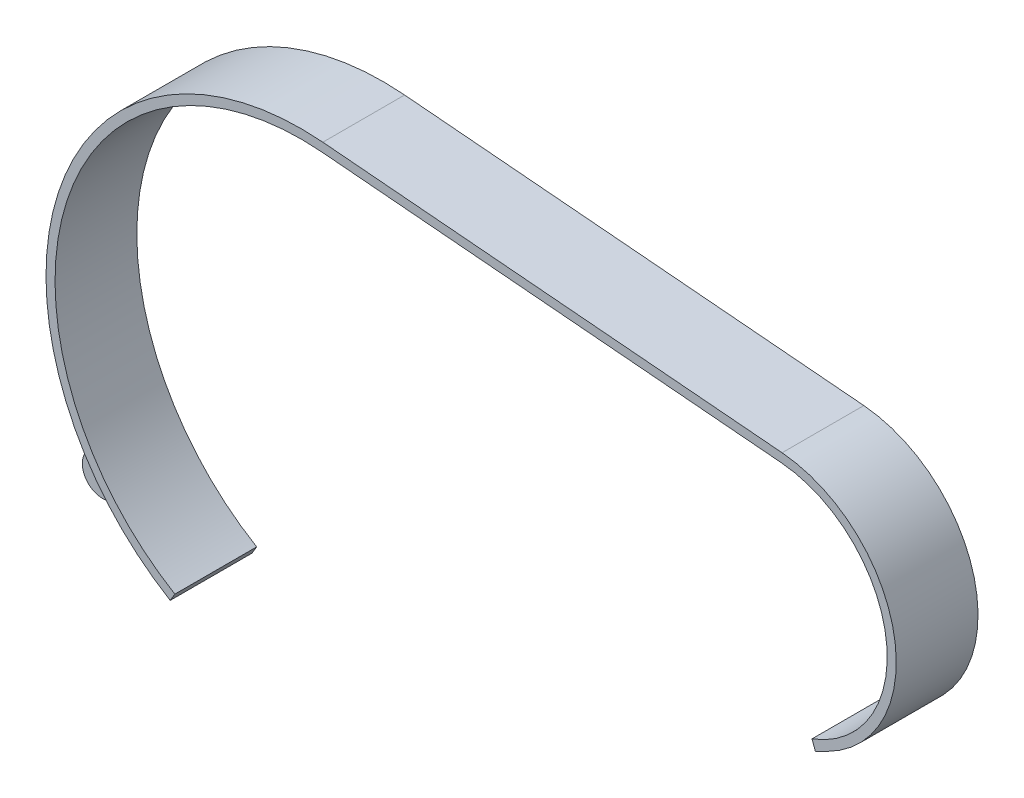
ISO-10303-21;
HEADER;
FILE_DESCRIPTION(('STEP AP214'),'2;1');
FILE_NAME('part.step','',(''),(''),'','','');
FILE_SCHEMA(('AUTOMOTIVE_DESIGN { 1 0 10303 214 1 1 1 1 }'));
ENDSEC;
DATA;
#1=APPLICATION_CONTEXT('core data for automotive mechanical design processes');
#2=APPLICATION_PROTOCOL_DEFINITION('international standard','automotive_design',2000,#1);
#3=PRODUCT_CONTEXT('',#1,'mechanical');
#4=PRODUCT('Part','Part','',(#3));
#5=PRODUCT_RELATED_PRODUCT_CATEGORY('part','',(#4));
#6=PRODUCT_DEFINITION_FORMATION('','',#4);
#7=PRODUCT_DEFINITION_CONTEXT('part definition',#1,'design');
#8=PRODUCT_DEFINITION('design','',#6,#7);
#9=PRODUCT_DEFINITION_SHAPE('','',#8);
#10=(LENGTH_UNIT() NAMED_UNIT(*) SI_UNIT(.MILLI.,.METRE.));
#11=(NAMED_UNIT(*) PLANE_ANGLE_UNIT() SI_UNIT($,.RADIAN.));
#12=(NAMED_UNIT(*) SI_UNIT($,.STERADIAN.) SOLID_ANGLE_UNIT());
#13=UNCERTAINTY_MEASURE_WITH_UNIT(LENGTH_MEASURE(1.E-05),#10,'distance_accuracy_value','');
#14=(GEOMETRIC_REPRESENTATION_CONTEXT(3) GLOBAL_UNCERTAINTY_ASSIGNED_CONTEXT((#13)) GLOBAL_UNIT_ASSIGNED_CONTEXT((#10,
#11,#12)) REPRESENTATION_CONTEXT('',''));
#15=CARTESIAN_POINT('',(0.,0.,0.));
#16=DIRECTION('',(0.,0.,1.));
#17=DIRECTION('',(1.,0.,0.));
#18=AXIS2_PLACEMENT_3D('',#15,#16,#17);
#19=CARTESIAN_POINT('',(279.400000000399,127.000000000261,25.4));
#20=DIRECTION('',(0.,0.,-1.));
#21=DIRECTION('',(-1.,0.,0.));
#22=AXIS2_PLACEMENT_3D('',#19,#20,#21);
#23=CYLINDRICAL_SURFACE('',#22,43.815);
#24=CARTESIAN_POINT('',(279.400000000399,127.000000000261,0.));
#25=DIRECTION('',(0.,0.,1.));
#26=DIRECTION('',(1.,0.,0.));
#27=AXIS2_PLACEMENT_3D('',#24,#25,#26);
#28=CIRCLE('',#27,43.815);
#29=CARTESIAN_POINT('',(299.063190221531,87.8450108503763,0.));
#30=VERTEX_POINT('',#29);
#31=CARTESIAN_POINT('',(283.138145014646,170.65524592618,0.));
#32=VERTEX_POINT('',#31);
#33=EDGE_CURVE('E232',#30,#32,#28,.T.);
#34=ORIENTED_EDGE('',*,*,#33,.T.);
#35=DIRECTION('',(0.,0.,-1.));
#36=VECTOR('',#35,1.);
#37=CARTESIAN_POINT('',(283.138145014646,170.65524592618,25.4));
#38=LINE('',#37,#36);
#39=CARTESIAN_POINT('',(283.138145014646,170.65524592618,28.702));
#40=VERTEX_POINT('',#39);
#41=EDGE_CURVE('E11',#40,#32,#38,.T.);
#42=ORIENTED_EDGE('',*,*,#41,.F.);
#43=CARTESIAN_POINT('',(279.400000000399,127.000000000261,28.702));
#44=DIRECTION('',(0.,0.,1.));
#45=DIRECTION('',(1.,0.,0.));
#46=AXIS2_PLACEMENT_3D('',#43,#44,#45);
#47=CIRCLE('',#46,43.815);
#48=CARTESIAN_POINT('',(299.063190221531,87.8450108503763,28.702));
#49=VERTEX_POINT('',#48);
#50=EDGE_CURVE('E178',#49,#40,#47,.T.);
#51=ORIENTED_EDGE('',*,*,#50,.F.);
#52=DIRECTION('',(0.,0.,-1.));
#53=VECTOR('',#52,1.);
#54=CARTESIAN_POINT('',(299.063190221531,87.8450108503763,25.4));
#55=LINE('',#54,#53);
#56=EDGE_CURVE('E269',#49,#30,#55,.T.);
#57=ORIENTED_EDGE('',*,*,#56,.T.);
#58=EDGE_LOOP('',(#34,#42,#51,#57));
#59=FACE_BOUND('',#58,.T.);
#60=ADVANCED_FACE('F47',(#59),#23,.T.);
#61=CARTESIAN_POINT('',(16.5675705685699,193.481356343731,25.4));
#62=DIRECTION('',(-0.0853165585814522,-0.996353895376446,0.));
#63=DIRECTION('',(0.996353895376446,-0.0853165585814522,0.));
#64=AXIS2_PLACEMENT_3D('',#61,#62,#63);
#65=PLANE('',#64);
#66=DIRECTION('',(-0.996353895376446,0.0853165585814522,0.));
#67=VECTOR('',#66,1.);
#68=CARTESIAN_POINT('',(16.5675705685699,193.481356343731,0.));
#69=LINE('',#68,#67);
#70=CARTESIAN_POINT('',(121.938818072989,184.458546022791,0.));
#71=VERTEX_POINT('',#70);
#72=EDGE_CURVE('E243',#32,#71,#69,.T.);
#73=ORIENTED_EDGE('',*,*,#72,.T.);
#74=DIRECTION('',(0.,0.,-1.));
#75=VECTOR('',#74,1.);
#76=CARTESIAN_POINT('',(121.938818072989,184.458546022791,25.4));
#77=LINE('',#76,#75);
#78=CARTESIAN_POINT('',(121.938818072989,184.458546022791,28.702));
#79=VERTEX_POINT('',#78);
#80=EDGE_CURVE('E55',#79,#71,#77,.T.);
#81=ORIENTED_EDGE('',*,*,#80,.F.);
#82=DIRECTION('',(-0.996353895376446,0.0853165585814522,0.));
#83=VECTOR('',#82,1.);
#84=CARTESIAN_POINT('',(16.5675705685699,193.481356343731,28.702));
#85=LINE('',#84,#83);
#86=EDGE_CURVE('E182',#40,#79,#85,.T.);
#87=ORIENTED_EDGE('',*,*,#86,.F.);
#88=ORIENTED_EDGE('',*,*,#41,.T.);
#89=EDGE_LOOP('',(#73,#81,#87,#88));
#90=FACE_BOUND('',#89,.T.);
#91=ADVANCED_FACE('F321',(#90),#65,.F.);
#92=CARTESIAN_POINT('',(114.300000000399,95.2500000002611,25.4));
#93=DIRECTION('',(0.,0.,-1.));
#94=DIRECTION('',(-1.,0.,0.));
#95=AXIS2_PLACEMENT_3D('',#92,#93,#94);
#96=CYLINDRICAL_SURFACE('',#95,89.535);
#97=CARTESIAN_POINT('',(114.300000000399,95.2500000002611,3.175));
#98=DIRECTION('',(0.,0.,-1.));
#99=DIRECTION('',(-1.,0.,0.));
#100=AXIS2_PLACEMENT_3D('',#97,#98,#99);
#101=CIRCLE('',#100,89.535);
#102=CARTESIAN_POINT('',(53.858754358076,29.1941747446156,3.175));
#103=VERTEX_POINT('',#102);
#104=CARTESIAN_POINT('',(36.5877019270314,50.7829902834378,3.175));
#105=VERTEX_POINT('',#104);
#106=EDGE_CURVE('E66',#103,#105,#101,.T.);
#107=ORIENTED_EDGE('',*,*,#106,.F.);
#108=DIRECTION('',(0.,0.,-1.));
#109=VECTOR('',#108,1.);
#110=CARTESIAN_POINT('',(53.858754358076,29.1941747446156,3.175));
#111=LINE('',#110,#109);
#112=CARTESIAN_POINT('',(53.858754358076,29.1941747446156,0.));
#113=VERTEX_POINT('',#112);
#114=EDGE_CURVE('E229',#103,#113,#111,.T.);
#115=ORIENTED_EDGE('',*,*,#114,.T.);
#116=CARTESIAN_POINT('',(114.300000000399,95.2500000002611,0.));
#117=DIRECTION('',(0.,0.,1.));
#118=DIRECTION('',(1.,0.,0.));
#119=AXIS2_PLACEMENT_3D('',#116,#117,#118);
#120=CIRCLE('',#119,89.535);
#121=CARTESIAN_POINT('',(68.3731081412103,18.3914492127633,0.));
#122=VERTEX_POINT('',#121);
#123=EDGE_CURVE('E246',#113,#122,#120,.T.);
#124=ORIENTED_EDGE('',*,*,#123,.T.);
#125=DIRECTION('',(0.,0.,-1.));
#126=VECTOR('',#125,1.);
#127=CARTESIAN_POINT('',(68.3731081412103,18.3914492127633,25.4));
#128=LINE('',#127,#126);
#129=CARTESIAN_POINT('',(68.3731081412103,18.3914492127633,28.702));
#130=VERTEX_POINT('',#129);
#131=EDGE_CURVE('E284',#130,#122,#128,.T.);
#132=ORIENTED_EDGE('',*,*,#131,.F.);
#133=CARTESIAN_POINT('',(114.300000000399,95.2500000002611,28.702));
#134=DIRECTION('',(0.,0.,1.));
#135=DIRECTION('',(1.,0.,0.));
#136=AXIS2_PLACEMENT_3D('',#133,#134,#135);
#137=CIRCLE('',#136,89.535);
#138=EDGE_CURVE('E186',#79,#130,#137,.T.);
#139=ORIENTED_EDGE('',*,*,#138,.F.);
#140=ORIENTED_EDGE('',*,*,#80,.T.);
#141=CARTESIAN_POINT('',(36.5877019270314,50.7829902834378,0.));
#142=VERTEX_POINT('',#141);
#143=EDGE_CURVE('E247',#71,#142,#120,.T.);
#144=ORIENTED_EDGE('',*,*,#143,.T.);
#145=DIRECTION('',(0.,0.,-1.));
#146=VECTOR('',#145,1.);
#147=CARTESIAN_POINT('',(36.5877019270314,50.7829902834378,3.175));
#148=LINE('',#147,#146);
#149=EDGE_CURVE('E62',#105,#142,#148,.T.);
#150=ORIENTED_EDGE('',*,*,#149,.F.);
#151=EDGE_LOOP('',(#107,#115,#124,#132,#139,#140,#144,#150));
#152=FACE_BOUND('',#151,.T.);
#153=ADVANCED_FACE('F291',(#152),#96,.T.);
#154=CARTESIAN_POINT('',(42.2847815905695,-25.2673069099216,25.4));
#155=DIRECTION('',(0.858419062796647,-0.512949035116869,0.));
#156=DIRECTION('',(0.512949035116869,0.858419062796647,0.));
#157=AXIS2_PLACEMENT_3D('',#154,#155,#156);
#158=PLANE('',#157);
#159=DIRECTION('',(-0.512949035116869,-0.858419062796647,0.));
#160=VECTOR('',#159,1.);
#161=CARTESIAN_POINT('',(42.2847815905695,-25.2673069099216,0.));
#162=LINE('',#161,#160);
#163=CARTESIAN_POINT('',(70.0017213277063,21.1169297371427,0.));
#164=VERTEX_POINT('',#163);
#165=EDGE_CURVE('E250',#164,#122,#162,.T.);
#166=ORIENTED_EDGE('',*,*,#165,.F.);
#167=DIRECTION('',(0.,0.,-1.));
#168=VECTOR('',#167,1.);
#169=CARTESIAN_POINT('',(70.0017213277063,21.1169297371427,25.4));
#170=LINE('',#169,#168);
#171=CARTESIAN_POINT('',(70.0017213277063,21.1169297371427,28.702));
#172=VERTEX_POINT('',#171);
#173=EDGE_CURVE('E281',#172,#164,#170,.T.);
#174=ORIENTED_EDGE('',*,*,#173,.F.);
#175=DIRECTION('',(0.512949035116869,0.858419062796647,0.));
#176=VECTOR('',#175,1.);
#177=CARTESIAN_POINT('',(42.2847815905695,-25.2673069099216,28.702));
#178=LINE('',#177,#176);
#179=EDGE_CURVE('E190',#130,#172,#178,.T.);
#180=ORIENTED_EDGE('',*,*,#179,.F.);
#181=ORIENTED_EDGE('',*,*,#131,.T.);
#182=EDGE_LOOP('',(#166,#174,#180,#181));
#183=FACE_BOUND('',#182,.T.);
#184=ADVANCED_FACE('F316',(#183),#158,.T.);
#185=CARTESIAN_POINT('',(114.300000000399,95.2500000002611,25.4));
#186=DIRECTION('',(0.,0.,-1.));
#187=DIRECTION('',(-1.,0.,0.));
#188=AXIS2_PLACEMENT_3D('',#185,#186,#187);
#189=CYLINDRICAL_SURFACE('',#188,86.36);
#190=CARTESIAN_POINT('',(114.300000000399,95.2500000002611,0.));
#191=DIRECTION('',(0.,0.,1.));
#192=DIRECTION('',(1.,0.,0.));
#193=AXIS2_PLACEMENT_3D('',#190,#191,#192);
#194=CIRCLE('',#193,86.36);
#195=CARTESIAN_POINT('',(121.667937999493,181.295122404971,0.));
#196=VERTEX_POINT('',#195);
#197=EDGE_CURVE('E254',#196,#164,#194,.T.);
#198=ORIENTED_EDGE('',*,*,#197,.F.);
#199=DIRECTION('',(0.,0.,-1.));
#200=VECTOR('',#199,1.);
#201=CARTESIAN_POINT('',(121.667937999493,181.295122404971,25.4));
#202=LINE('',#201,#200);
#203=CARTESIAN_POINT('',(121.667937999493,181.295122404971,28.702));
#204=VERTEX_POINT('',#203);
#205=EDGE_CURVE('E152',#204,#196,#202,.T.);
#206=ORIENTED_EDGE('',*,*,#205,.F.);
#207=CARTESIAN_POINT('',(114.300000000399,95.2500000002611,28.702));
#208=DIRECTION('',(0.,0.,1.));
#209=DIRECTION('',(1.,0.,0.));
#210=AXIS2_PLACEMENT_3D('',#207,#208,#209);
#211=CIRCLE('',#210,86.36);
#212=EDGE_CURVE('E168',#172,#204,#211,.F.);
#213=ORIENTED_EDGE('',*,*,#212,.F.);
#214=ORIENTED_EDGE('',*,*,#173,.T.);
#215=EDGE_LOOP('',(#198,#206,#213,#214));
#216=FACE_BOUND('',#215,.T.);
#217=ADVANCED_FACE('F319',(#216),#189,.F.);
#218=CARTESIAN_POINT('',(16.2966904950739,190.317932725911,25.4));
#219=DIRECTION('',(0.0853165585814526,0.996353895376446,0.));
#220=DIRECTION('',(-0.996353895376446,0.0853165585814526,0.));
#221=AXIS2_PLACEMENT_3D('',#218,#219,#220);
#222=PLANE('',#221);
#223=DIRECTION('',(0.996353895376446,-0.0853165585814526,0.));
#224=VECTOR('',#223,1.);
#225=CARTESIAN_POINT('',(16.2966904950739,190.317932725911,0.));
#226=LINE('',#225,#224);
#227=CARTESIAN_POINT('',(282.867264941149,167.49182230836,0.));
#228=VERTEX_POINT('',#227);
#229=EDGE_CURVE('E147',#196,#228,#226,.T.);
#230=ORIENTED_EDGE('',*,*,#229,.T.);
#231=DIRECTION('',(0.,0.,-1.));
#232=VECTOR('',#231,1.);
#233=CARTESIAN_POINT('',(282.867264941149,167.49182230836,25.4));
#234=LINE('',#233,#232);
#235=CARTESIAN_POINT('',(282.867264941149,167.49182230836,28.702));
#236=VERTEX_POINT('',#235);
#237=EDGE_CURVE('E141',#236,#228,#234,.T.);
#238=ORIENTED_EDGE('',*,*,#237,.F.);
#239=DIRECTION('',(0.996353895376446,-0.0853165585814526,0.));
#240=VECTOR('',#239,1.);
#241=CARTESIAN_POINT('',(16.2966904950739,190.317932725911,28.702));
#242=LINE('',#241,#240);
#243=EDGE_CURVE('E145',#204,#236,#242,.T.);
#244=ORIENTED_EDGE('',*,*,#243,.F.);
#245=ORIENTED_EDGE('',*,*,#205,.T.);
#246=EDGE_LOOP('',(#230,#238,#244,#245));
#247=FACE_BOUND('',#246,.T.);
#248=ADVANCED_FACE('F143',(#247),#222,.F.);
#249=CARTESIAN_POINT('',(279.400000000399,127.000000000261,25.4));
#250=DIRECTION('',(0.,0.,-1.));
#251=DIRECTION('',(-1.,0.,0.));
#252=AXIS2_PLACEMENT_3D('',#249,#250,#251);
#253=CYLINDRICAL_SURFACE('',#252,40.64);
#254=CARTESIAN_POINT('',(279.400000000399,127.000000000261,0.));
#255=DIRECTION('',(0.,0.,1.));
#256=DIRECTION('',(1.,0.,0.));
#257=AXIS2_PLACEMENT_3D('',#254,#255,#256);
#258=CIRCLE('',#257,40.64);
#259=CARTESIAN_POINT('',(293.637822611597,88.9356596369754,0.));
#260=VERTEX_POINT('',#259);
#261=EDGE_CURVE('E260',#260,#228,#258,.T.);
#262=ORIENTED_EDGE('',*,*,#261,.F.);
#263=DIRECTION('',(0.,0.,-1.));
#264=VECTOR('',#263,1.);
#265=CARTESIAN_POINT('',(293.637822611597,88.9356596369754,25.4));
#266=LINE('',#265,#264);
#267=CARTESIAN_POINT('',(293.637822611597,88.9356596369754,28.702));
#268=VERTEX_POINT('',#267);
#269=EDGE_CURVE('E153',#268,#260,#266,.T.);
#270=ORIENTED_EDGE('',*,*,#269,.F.);
#271=CARTESIAN_POINT('',(279.400000000399,127.000000000261,28.702));
#272=DIRECTION('',(0.,0.,1.));
#273=DIRECTION('',(1.,0.,0.));
#274=AXIS2_PLACEMENT_3D('',#271,#272,#273);
#275=CIRCLE('',#274,40.64);
#276=EDGE_CURVE('E156',#236,#268,#275,.F.);
#277=ORIENTED_EDGE('',*,*,#276,.F.);
#278=ORIENTED_EDGE('',*,*,#237,.T.);
#279=EDGE_LOOP('',(#262,#270,#277,#278));
#280=FACE_BOUND('',#279,.T.);
#281=ADVANCED_FACE('F157',(#280),#253,.F.);
#282=CARTESIAN_POINT('',(286.780276663457,107.269078317272,25.4));
#283=DIRECTION('',(0.936622548309194,0.350340123307038,0.));
#284=DIRECTION('',(-0.350340123307038,0.936622548309194,0.));
#285=AXIS2_PLACEMENT_3D('',#282,#283,#284);
#286=PLANE('',#285);
#287=DIRECTION('',(0.350340123307038,-0.936622548309194,0.));
#288=VECTOR('',#287,1.);
#289=CARTESIAN_POINT('',(286.780276663457,107.269078317272,0.));
#290=LINE('',#289,#288);
#291=CARTESIAN_POINT('',(294.839214659134,85.723778364399,0.));
#292=VERTEX_POINT('',#291);
#293=EDGE_CURVE('E263',#260,#292,#290,.T.);
#294=ORIENTED_EDGE('',*,*,#293,.T.);
#295=DIRECTION('',(0.,0.,-1.));
#296=VECTOR('',#295,1.);
#297=CARTESIAN_POINT('',(294.839214659134,85.723778364399,25.4));
#298=LINE('',#297,#296);
#299=CARTESIAN_POINT('',(294.839214659134,85.723778364399,28.702));
#300=VERTEX_POINT('',#299);
#301=EDGE_CURVE('E273',#300,#292,#298,.T.);
#302=ORIENTED_EDGE('',*,*,#301,.F.);
#303=DIRECTION('',(0.350340123307038,-0.936622548309194,0.));
#304=VECTOR('',#303,1.);
#305=CARTESIAN_POINT('',(286.780276663457,107.269078317272,28.702));
#306=LINE('',#305,#304);
#307=EDGE_CURVE('E162',#268,#300,#306,.T.);
#308=ORIENTED_EDGE('',*,*,#307,.F.);
#309=ORIENTED_EDGE('',*,*,#269,.T.);
#310=EDGE_LOOP('',(#294,#302,#308,#309));
#311=FACE_BOUND('',#310,.T.);
#312=ADVANCED_FACE('F329',(#311),#286,.F.);
#313=CARTESIAN_POINT('',(25.0017305276841,-49.7855371651626,25.4));
#314=DIRECTION('',(-0.4487775926311,0.893643481681724,0.));
#315=DIRECTION('',(-0.893643481681724,-0.4487775926311,0.));
#316=AXIS2_PLACEMENT_3D('',#313,#314,#315);
#317=PLANE('',#316);
#318=DIRECTION('',(0.893643481681724,0.4487775926311,0.));
#319=VECTOR('',#318,1.);
#320=CARTESIAN_POINT('',(25.0017305276841,-49.7855371651626,0.));
#321=LINE('',#320,#319);
#322=EDGE_CURVE('E266',#292,#30,#321,.T.);
#323=ORIENTED_EDGE('',*,*,#322,.T.);
#324=ORIENTED_EDGE('',*,*,#56,.F.);
#325=DIRECTION('',(0.893643481681724,0.4487775926311,0.));
#326=VECTOR('',#325,1.);
#327=CARTESIAN_POINT('',(25.0017305276841,-49.7855371651626,28.702));
#328=LINE('',#327,#326);
#329=EDGE_CURVE('E174',#300,#49,#328,.T.);
#330=ORIENTED_EDGE('',*,*,#329,.F.);
#331=ORIENTED_EDGE('',*,*,#301,.T.);
#332=EDGE_LOOP('',(#323,#324,#330,#331));
#333=FACE_BOUND('',#332,.T.);
#334=ADVANCED_FACE('F326',(#333),#317,.F.);
#335=CARTESIAN_POINT('',(0.,0.,0.));
#336=DIRECTION('',(0.,0.,1.));
#337=DIRECTION('',(1.,0.,0.));
#338=AXIS2_PLACEMENT_3D('',#335,#336,#337);
#339=PLANE('',#338);
#340=ORIENTED_EDGE('',*,*,#33,.F.);
#341=ORIENTED_EDGE('',*,*,#322,.F.);
#342=ORIENTED_EDGE('',*,*,#293,.F.);
#343=ORIENTED_EDGE('',*,*,#261,.T.);
#344=ORIENTED_EDGE('',*,*,#229,.F.);
#345=ORIENTED_EDGE('',*,*,#197,.T.);
#346=ORIENTED_EDGE('',*,*,#165,.T.);
#347=ORIENTED_EDGE('',*,*,#123,.F.);
#348=DIRECTION('',(-0.88702383299734,-0.461723639956529,0.));
#349=VECTOR('',#348,1.);
#350=CARTESIAN_POINT('',(-0.474683611867195,0.911921418836391,0.));
#351=LINE('',#350,#349);
#352=CARTESIAN_POINT('',(22.3161868566906,12.7752821077615,0.));
#353=VERTEX_POINT('',#352);
#354=EDGE_CURVE('E195',#113,#353,#351,.T.);
#355=ORIENTED_EDGE('',*,*,#354,.T.);
#356=CARTESIAN_POINT('',(19.0500000000022,19.0500000000013,0.));
#357=DIRECTION('',(0.,0.,-1.));
#358=DIRECTION('',(-1.,0.,0.));
#359=AXIS2_PLACEMENT_3D('',#356,#357,#358);
#360=CIRCLE('',#359,7.07389999999997);
#361=CARTESIAN_POINT('',(13.6452918541666,23.6139008609248,0.));
#362=VERTEX_POINT('',#361);
#363=EDGE_CURVE('E218',#353,#362,#360,.T.);
#364=ORIENTED_EDGE('',*,*,#363,.T.);
#365=DIRECTION('',(-0.645174636469765,-0.764035135616227,0.));
#366=VECTOR('',#365,1.);
#367=CARTESIAN_POINT('',(-3.67470911184497,3.10303676473535,0.));
#368=LINE('',#367,#366);
#369=EDGE_CURVE('E222',#142,#362,#368,.T.);
#370=ORIENTED_EDGE('',*,*,#369,.F.);
#371=ORIENTED_EDGE('',*,*,#143,.F.);
#372=ORIENTED_EDGE('',*,*,#72,.F.);
#373=EDGE_LOOP('',(#340,#341,#342,#343,#344,#345,#346,#347,#355,#364,#370,#371,#372));
#374=FACE_BOUND('',#373,.T.);
#375=CARTESIAN_POINT('',(19.0500000000022,19.0500000000013,0.));
#376=DIRECTION('',(0.,0.,-1.));
#377=DIRECTION('',(-1.,0.,0.));
#378=AXIS2_PLACEMENT_3D('',#375,#376,#377);
#379=CIRCLE('',#378,3.2639);
#380=CARTESIAN_POINT('',(15.7861000000022,19.0500000000013,0.));
#381=VERTEX_POINT('',#380);
#382=EDGE_CURVE('E201',#381,#381,#379,.T.);
#383=ORIENTED_EDGE('',*,*,#382,.F.);
#384=EDGE_LOOP('',(#383));
#385=FACE_BOUND('',#384,.T.);
#386=ADVANCED_FACE('F297',(#374,#385),#339,.F.);
#387=CARTESIAN_POINT('',(-0.474683611867195,0.911921418836391,3.175));
#388=DIRECTION('',(0.461723639956529,-0.88702383299734,0.));
#389=DIRECTION('',(0.88702383299734,0.461723639956529,0.));
#390=AXIS2_PLACEMENT_3D('',#387,#388,#389);
#391=PLANE('',#390);
#392=ORIENTED_EDGE('',*,*,#354,.F.);
#393=ORIENTED_EDGE('',*,*,#114,.F.);
#394=DIRECTION('',(-0.88702383299734,-0.461723639956529,0.));
#395=VECTOR('',#394,1.);
#396=CARTESIAN_POINT('',(-0.474683611867195,0.911921418836391,3.175));
#397=LINE('',#396,#395);
#398=CARTESIAN_POINT('',(22.3161868566906,12.7752821077615,3.175));
#399=VERTEX_POINT('',#398);
#400=EDGE_CURVE('E196',#103,#399,#397,.T.);
#401=ORIENTED_EDGE('',*,*,#400,.T.);
#402=DIRECTION('',(0.,0.,-1.));
#403=VECTOR('',#402,1.);
#404=CARTESIAN_POINT('',(22.3161868566906,12.7752821077615,3.175));
#405=LINE('',#404,#403);
#406=EDGE_CURVE('E214',#399,#353,#405,.T.);
#407=ORIENTED_EDGE('',*,*,#406,.T.);
#408=EDGE_LOOP('',(#392,#393,#401,#407));
#409=FACE_BOUND('',#408,.T.);
#410=ADVANCED_FACE('F311',(#409),#391,.T.);
#411=CARTESIAN_POINT('',(-3.67470911184497,3.10303676473535,3.175));
#412=DIRECTION('',(0.764035135616227,-0.645174636469765,0.));
#413=DIRECTION('',(0.645174636469765,0.764035135616227,0.));
#414=AXIS2_PLACEMENT_3D('',#411,#412,#413);
#415=PLANE('',#414);
#416=ORIENTED_EDGE('',*,*,#369,.T.);
#417=DIRECTION('',(0.,0.,-1.));
#418=VECTOR('',#417,1.);
#419=CARTESIAN_POINT('',(13.6452918541666,23.6139008609248,3.175));
#420=LINE('',#419,#418);
#421=CARTESIAN_POINT('',(13.6452918541666,23.6139008609248,3.175));
#422=VERTEX_POINT('',#421);
#423=EDGE_CURVE('E235',#422,#362,#420,.T.);
#424=ORIENTED_EDGE('',*,*,#423,.F.);
#425=DIRECTION('',(-0.645174636469765,-0.764035135616227,0.));
#426=VECTOR('',#425,1.);
#427=CARTESIAN_POINT('',(-3.67470911184497,3.10303676473535,3.175));
#428=LINE('',#427,#426);
#429=EDGE_CURVE('E205',#105,#422,#428,.T.);
#430=ORIENTED_EDGE('',*,*,#429,.F.);
#431=ORIENTED_EDGE('',*,*,#149,.T.);
#432=EDGE_LOOP('',(#416,#424,#430,#431));
#433=FACE_BOUND('',#432,.T.);
#434=ADVANCED_FACE('F302',(#433),#415,.F.);
#435=CARTESIAN_POINT('',(19.0500000000022,19.0500000000013,3.175));
#436=DIRECTION('',(0.,0.,-1.));
#437=DIRECTION('',(-1.,0.,0.));
#438=AXIS2_PLACEMENT_3D('',#435,#436,#437);
#439=CYLINDRICAL_SURFACE('',#438,7.07389999999997);
#440=ORIENTED_EDGE('',*,*,#363,.F.);
#441=ORIENTED_EDGE('',*,*,#406,.F.);
#442=CARTESIAN_POINT('',(19.0500000000022,19.0500000000013,3.175));
#443=DIRECTION('',(0.,0.,-1.));
#444=DIRECTION('',(-1.,0.,0.));
#445=AXIS2_PLACEMENT_3D('',#442,#443,#444);
#446=CIRCLE('',#445,7.07389999999997);
#447=EDGE_CURVE('E200',#399,#422,#446,.T.);
#448=ORIENTED_EDGE('',*,*,#447,.T.);
#449=ORIENTED_EDGE('',*,*,#423,.T.);
#450=EDGE_LOOP('',(#440,#441,#448,#449));
#451=FACE_BOUND('',#450,.T.);
#452=ADVANCED_FACE('F422',(#451),#439,.T.);
#453=CARTESIAN_POINT('',(19.0500000000022,19.0500000000013,3.175));
#454=DIRECTION('',(0.,0.,-1.));
#455=DIRECTION('',(-1.,0.,0.));
#456=AXIS2_PLACEMENT_3D('',#453,#454,#455);
#457=CYLINDRICAL_SURFACE('',#456,3.2639);
#458=CARTESIAN_POINT('',(19.0500000000022,19.0500000000013,3.175));
#459=DIRECTION('',(0.,0.,-1.));
#460=DIRECTION('',(-1.,0.,0.));
#461=AXIS2_PLACEMENT_3D('',#458,#459,#460);
#462=CIRCLE('',#461,3.2639);
#463=CARTESIAN_POINT('',(15.7861000000022,19.0500000000013,3.175));
#464=VERTEX_POINT('',#463);
#465=EDGE_CURVE('E210',#464,#464,#462,.T.);
#466=ORIENTED_EDGE('',*,*,#465,.F.);
#467=EDGE_LOOP('',(#466));
#468=FACE_BOUND('',#467,.T.);
#469=ORIENTED_EDGE('',*,*,#382,.T.);
#470=EDGE_LOOP('',(#469));
#471=FACE_BOUND('',#470,.T.);
#472=ADVANCED_FACE('F413',(#468,#471),#457,.F.);
#473=CARTESIAN_POINT('',(0.,0.,3.175));
#474=DIRECTION('',(0.,0.,-1.));
#475=DIRECTION('',(-1.,0.,0.));
#476=AXIS2_PLACEMENT_3D('',#473,#474,#475);
#477=PLANE('',#476);
#478=ORIENTED_EDGE('',*,*,#400,.F.);
#479=ORIENTED_EDGE('',*,*,#106,.T.);
#480=ORIENTED_EDGE('',*,*,#429,.T.);
#481=ORIENTED_EDGE('',*,*,#447,.F.);
#482=EDGE_LOOP('',(#478,#479,#480,#481));
#483=FACE_BOUND('',#482,.T.);
#484=ORIENTED_EDGE('',*,*,#465,.T.);
#485=EDGE_LOOP('',(#484));
#486=FACE_BOUND('',#485,.T.);
#487=ADVANCED_FACE('F307',(#483,#486),#477,.F.);
#488=CARTESIAN_POINT('',(0.,0.,28.702));
#489=DIRECTION('',(0.,0.,1.));
#490=DIRECTION('',(1.,0.,0.));
#491=AXIS2_PLACEMENT_3D('',#488,#489,#490);
#492=PLANE('',#491);
#493=ORIENTED_EDGE('',*,*,#243,.T.);
#494=ORIENTED_EDGE('',*,*,#276,.T.);
#495=ORIENTED_EDGE('',*,*,#307,.T.);
#496=ORIENTED_EDGE('',*,*,#329,.T.);
#497=ORIENTED_EDGE('',*,*,#50,.T.);
#498=ORIENTED_EDGE('',*,*,#86,.T.);
#499=ORIENTED_EDGE('',*,*,#138,.T.);
#500=ORIENTED_EDGE('',*,*,#179,.T.);
#501=ORIENTED_EDGE('',*,*,#212,.T.);
#502=EDGE_LOOP('',(#493,#494,#495,#496,#497,#498,#499,#500,#501));
#503=FACE_BOUND('',#502,.T.);
#504=ADVANCED_FACE('F165',(#503),#492,.T.);
#505=CLOSED_SHELL('',(#60,#91,#153,#184,#217,#248,#281,#312,#334,#386,#410,#434,#452,#472,#487,#504));
#506=MANIFOLD_SOLID_BREP('B2',#505);
#507=ADVANCED_BREP_SHAPE_REPRESENTATION('',(#18,#506),#14);
#508=SHAPE_DEFINITION_REPRESENTATION(#9,#507);
ENDSEC;
END-ISO-10303-21;
